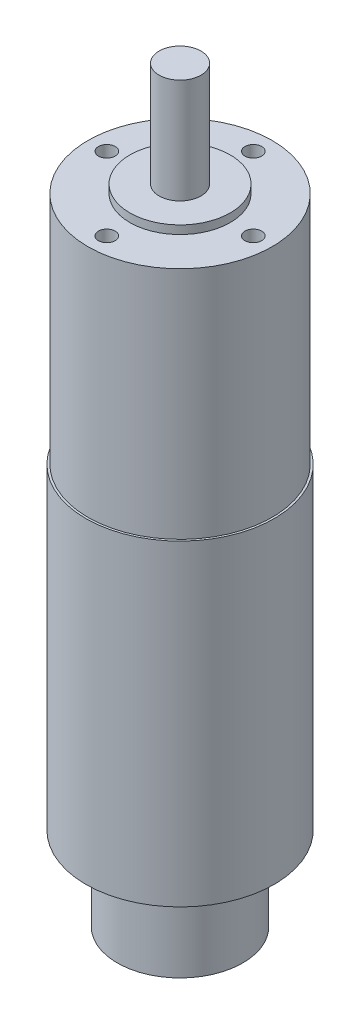
ISO-10303-21;
HEADER;
FILE_DESCRIPTION(('STEP AP214'),'2;1');
FILE_NAME('part.step','',(''),(''),'','','');
FILE_SCHEMA(('AUTOMOTIVE_DESIGN { 1 0 10303 214 1 1 1 1 }'));
ENDSEC;
DATA;
#1=APPLICATION_CONTEXT('core data for automotive mechanical design processes');
#2=APPLICATION_PROTOCOL_DEFINITION('international standard','automotive_design',2000,#1);
#3=PRODUCT_CONTEXT('',#1,'mechanical');
#4=PRODUCT('Part','Part','',(#3));
#5=PRODUCT_RELATED_PRODUCT_CATEGORY('part','',(#4));
#6=PRODUCT_DEFINITION_FORMATION('','',#4);
#7=PRODUCT_DEFINITION_CONTEXT('part definition',#1,'design');
#8=PRODUCT_DEFINITION('design','',#6,#7);
#9=PRODUCT_DEFINITION_SHAPE('','',#8);
#10=(LENGTH_UNIT() NAMED_UNIT(*) SI_UNIT(.MILLI.,.METRE.));
#11=(NAMED_UNIT(*) PLANE_ANGLE_UNIT() SI_UNIT($,.RADIAN.));
#12=(NAMED_UNIT(*) SI_UNIT($,.STERADIAN.) SOLID_ANGLE_UNIT());
#13=UNCERTAINTY_MEASURE_WITH_UNIT(LENGTH_MEASURE(1.E-05),#10,'distance_accuracy_value','');
#14=(GEOMETRIC_REPRESENTATION_CONTEXT(3) GLOBAL_UNCERTAINTY_ASSIGNED_CONTEXT((#13)) GLOBAL_UNIT_ASSIGNED_CONTEXT((#10,
#11,#12)) REPRESENTATION_CONTEXT('',''));
#15=CARTESIAN_POINT('',(0.,0.,0.));
#16=DIRECTION('',(0.,0.,1.));
#17=DIRECTION('',(1.,0.,0.));
#18=AXIS2_PLACEMENT_3D('',#15,#16,#17);
#19=CARTESIAN_POINT('',(0.,75.7,0.));
#20=DIRECTION('',(0.,-1.,0.));
#21=DIRECTION('',(0.,0.,-1.));
#22=AXIS2_PLACEMENT_3D('',#19,#20,#21);
#23=CYLINDRICAL_SURFACE('',#22,22.5);
#24=CARTESIAN_POINT('',(0.,75.7,0.));
#25=DIRECTION('',(0.,1.,0.));
#26=DIRECTION('',(0.,0.,1.));
#27=AXIS2_PLACEMENT_3D('',#24,#25,#26);
#28=CIRCLE('',#27,22.5);
#29=CARTESIAN_POINT('',(0.,75.7,22.5));
#30=VERTEX_POINT('',#29);
#31=EDGE_CURVE('E48',#30,#30,#28,.T.);
#32=ORIENTED_EDGE('',*,*,#31,.F.);
#33=EDGE_LOOP('',(#32));
#34=FACE_BOUND('',#33,.T.);
#35=CARTESIAN_POINT('',(0.,0.,0.));
#36=DIRECTION('',(0.,1.,0.));
#37=DIRECTION('',(0.,0.,1.));
#38=AXIS2_PLACEMENT_3D('',#35,#36,#37);
#39=CIRCLE('',#38,22.5);
#40=CARTESIAN_POINT('',(0.,0.,22.5));
#41=VERTEX_POINT('',#40);
#42=EDGE_CURVE('E88',#41,#41,#39,.T.);
#43=ORIENTED_EDGE('',*,*,#42,.T.);
#44=EDGE_LOOP('',(#43));
#45=FACE_BOUND('',#44,.T.);
#46=ADVANCED_FACE('F36',(#34,#45),#23,.T.);
#47=CARTESIAN_POINT('',(0.,75.7,0.));
#48=DIRECTION('',(0.,1.,0.));
#49=DIRECTION('',(0.,0.,1.));
#50=AXIS2_PLACEMENT_3D('',#47,#48,#49);
#51=PLANE('',#50);
#52=CARTESIAN_POINT('',(0.,75.7,0.));
#53=DIRECTION('',(0.,1.,0.));
#54=DIRECTION('',(0.,0.,1.));
#55=AXIS2_PLACEMENT_3D('',#52,#53,#54);
#56=CIRCLE('',#55,22.);
#57=CARTESIAN_POINT('',(0.,75.7,22.));
#58=VERTEX_POINT('',#57);
#59=EDGE_CURVE('E43',#58,#58,#56,.T.);
#60=ORIENTED_EDGE('',*,*,#59,.F.);
#61=EDGE_LOOP('',(#60));
#62=FACE_BOUND('',#61,.T.);
#63=ORIENTED_EDGE('',*,*,#31,.T.);
#64=EDGE_LOOP('',(#63));
#65=FACE_BOUND('',#64,.T.);
#66=ADVANCED_FACE('F98',(#62,#65),#51,.T.);
#67=CARTESIAN_POINT('',(0.,0.,0.));
#68=DIRECTION('',(0.,1.,0.));
#69=DIRECTION('',(0.,0.,1.));
#70=AXIS2_PLACEMENT_3D('',#67,#68,#69);
#71=PLANE('',#70);
#72=CARTESIAN_POINT('',(0.,0.,0.));
#73=DIRECTION('',(0.,-1.,0.));
#74=DIRECTION('',(0.,0.,-1.));
#75=AXIS2_PLACEMENT_3D('',#72,#73,#74);
#76=CIRCLE('',#75,15.);
#77=CARTESIAN_POINT('',(0.,0.,-15.));
#78=VERTEX_POINT('',#77);
#79=EDGE_CURVE('E10',#78,#78,#76,.T.);
#80=ORIENTED_EDGE('',*,*,#79,.F.);
#81=EDGE_LOOP('',(#80));
#82=FACE_BOUND('',#81,.T.);
#83=ORIENTED_EDGE('',*,*,#42,.F.);
#84=EDGE_LOOP('',(#83));
#85=FACE_BOUND('',#84,.T.);
#86=ADVANCED_FACE('F95',(#82,#85),#71,.F.);
#87=CARTESIAN_POINT('',(0.,131.7,0.));
#88=DIRECTION('',(0.,-1.,0.));
#89=DIRECTION('',(0.,0.,-1.));
#90=AXIS2_PLACEMENT_3D('',#87,#88,#89);
#91=CYLINDRICAL_SURFACE('',#90,22.);
#92=CARTESIAN_POINT('',(0.,131.7,0.));
#93=DIRECTION('',(0.,1.,0.));
#94=DIRECTION('',(0.,0.,1.));
#95=AXIS2_PLACEMENT_3D('',#92,#93,#94);
#96=CIRCLE('',#95,22.);
#97=CARTESIAN_POINT('',(0.,131.7,22.));
#98=VERTEX_POINT('',#97);
#99=EDGE_CURVE('E86',#98,#98,#96,.T.);
#100=ORIENTED_EDGE('',*,*,#99,.F.);
#101=EDGE_LOOP('',(#100));
#102=FACE_BOUND('',#101,.T.);
#103=ORIENTED_EDGE('',*,*,#59,.T.);
#104=EDGE_LOOP('',(#103));
#105=FACE_BOUND('',#104,.T.);
#106=ADVANCED_FACE('F97',(#102,#105),#91,.T.);
#107=CARTESIAN_POINT('',(0.,131.7,0.));
#108=DIRECTION('',(0.,1.,0.));
#109=DIRECTION('',(0.,0.,1.));
#110=AXIS2_PLACEMENT_3D('',#107,#108,#109);
#111=PLANE('',#110);
#112=CARTESIAN_POINT('',(0.,131.7,0.));
#113=DIRECTION('',(0.,1.,0.));
#114=DIRECTION('',(0.,0.,1.));
#115=AXIS2_PLACEMENT_3D('',#112,#113,#114);
#116=CIRCLE('',#115,12.);
#117=CARTESIAN_POINT('',(0.,131.7,12.));
#118=VERTEX_POINT('',#117);
#119=EDGE_CURVE('E56',#118,#118,#116,.T.);
#120=ORIENTED_EDGE('',*,*,#119,.F.);
#121=EDGE_LOOP('',(#120));
#122=FACE_BOUND('',#121,.T.);
#123=CARTESIAN_POINT('',(17.5,131.7,0.));
#124=DIRECTION('',(0.,1.,0.));
#125=DIRECTION('',(-1.,0.,0.));
#126=AXIS2_PLACEMENT_3D('',#123,#124,#125);
#127=CIRCLE('',#126,2.);
#128=CARTESIAN_POINT('',(15.5,131.7,0.));
#129=VERTEX_POINT('',#128);
#130=EDGE_CURVE('E63',#129,#129,#127,.T.);
#131=ORIENTED_EDGE('',*,*,#130,.F.);
#132=EDGE_LOOP('',(#131));
#133=FACE_BOUND('',#132,.T.);
#134=CARTESIAN_POINT('',(0.,131.7,17.5));
#135=DIRECTION('',(0.,1.,0.));
#136=DIRECTION('',(0.,0.,-1.));
#137=AXIS2_PLACEMENT_3D('',#134,#135,#136);
#138=CIRCLE('',#137,2.);
#139=CARTESIAN_POINT('',(0.,131.7,15.5));
#140=VERTEX_POINT('',#139);
#141=EDGE_CURVE('E69',#140,#140,#138,.T.);
#142=ORIENTED_EDGE('',*,*,#141,.F.);
#143=EDGE_LOOP('',(#142));
#144=FACE_BOUND('',#143,.T.);
#145=CARTESIAN_POINT('',(-17.5,131.7,-1.83302770289265E-13));
#146=DIRECTION('',(0.,1.,0.));
#147=DIRECTION('',(1.,0.,0.));
#148=AXIS2_PLACEMENT_3D('',#145,#146,#147);
#149=CIRCLE('',#148,2.);
#150=CARTESIAN_POINT('',(-15.5,131.7,-1.62353882256206E-13));
#151=VERTEX_POINT('',#150);
#152=EDGE_CURVE('E75',#151,#151,#149,.T.);
#153=ORIENTED_EDGE('',*,*,#152,.F.);
#154=EDGE_LOOP('',(#153));
#155=FACE_BOUND('',#154,.T.);
#156=CARTESIAN_POINT('',(0.,131.7,-17.5));
#157=DIRECTION('',(0.,1.,0.));
#158=DIRECTION('',(0.,0.,1.));
#159=AXIS2_PLACEMENT_3D('',#156,#157,#158);
#160=CIRCLE('',#159,2.);
#161=CARTESIAN_POINT('',(0.,131.7,-15.5));
#162=VERTEX_POINT('',#161);
#163=EDGE_CURVE('E62',#162,#162,#160,.T.);
#164=ORIENTED_EDGE('',*,*,#163,.F.);
#165=EDGE_LOOP('',(#164));
#166=FACE_BOUND('',#165,.T.);
#167=ORIENTED_EDGE('',*,*,#99,.T.);
#168=EDGE_LOOP('',(#167));
#169=FACE_BOUND('',#168,.T.);
#170=ADVANCED_FACE('F105',(#122,#133,#144,#155,#166,#169),#111,.T.);
#171=CARTESIAN_POINT('',(0.,122.7,-17.5));
#172=DIRECTION('',(0.,1.,0.));
#173=DIRECTION('',(0.,0.,1.));
#174=AXIS2_PLACEMENT_3D('',#171,#172,#173);
#175=CYLINDRICAL_SURFACE('',#174,2.);
#176=CARTESIAN_POINT('',(0.,122.7,-17.5));
#177=DIRECTION('',(0.,1.,0.));
#178=DIRECTION('',(0.,0.,1.));
#179=AXIS2_PLACEMENT_3D('',#176,#177,#178);
#180=CIRCLE('',#179,2.);
#181=CARTESIAN_POINT('',(0.,122.7,-15.5));
#182=VERTEX_POINT('',#181);
#183=EDGE_CURVE('E78',#182,#182,#180,.T.);
#184=ORIENTED_EDGE('',*,*,#183,.F.);
#185=EDGE_LOOP('',(#184));
#186=FACE_BOUND('',#185,.T.);
#187=ORIENTED_EDGE('',*,*,#163,.T.);
#188=EDGE_LOOP('',(#187));
#189=FACE_BOUND('',#188,.T.);
#190=ADVANCED_FACE('F136',(#186,#189),#175,.F.);
#191=CARTESIAN_POINT('',(0.,122.7,-17.5));
#192=DIRECTION('',(0.,1.,0.));
#193=DIRECTION('',(0.,0.,1.));
#194=AXIS2_PLACEMENT_3D('',#191,#192,#193);
#195=PLANE('',#194);
#196=ORIENTED_EDGE('',*,*,#183,.T.);
#197=EDGE_LOOP('',(#196));
#198=FACE_BOUND('',#197,.T.);
#199=ADVANCED_FACE('F146',(#198),#195,.T.);
#200=CARTESIAN_POINT('',(-17.5,122.7,-1.83302770289265E-13));
#201=DIRECTION('',(0.,1.,0.));
#202=DIRECTION('',(0.,0.,1.));
#203=AXIS2_PLACEMENT_3D('',#200,#201,#202);
#204=CYLINDRICAL_SURFACE('',#203,2.);
#205=CARTESIAN_POINT('',(-17.5,122.7,-1.83302770289265E-13));
#206=DIRECTION('',(0.,1.,0.));
#207=DIRECTION('',(1.,0.,0.));
#208=AXIS2_PLACEMENT_3D('',#205,#206,#207);
#209=CIRCLE('',#208,2.);
#210=CARTESIAN_POINT('',(-15.5,122.7,-1.62353882256206E-13));
#211=VERTEX_POINT('',#210);
#212=EDGE_CURVE('E72',#211,#211,#209,.T.);
#213=ORIENTED_EDGE('',*,*,#212,.F.);
#214=EDGE_LOOP('',(#213));
#215=FACE_BOUND('',#214,.T.);
#216=ORIENTED_EDGE('',*,*,#152,.T.);
#217=EDGE_LOOP('',(#216));
#218=FACE_BOUND('',#217,.T.);
#219=ADVANCED_FACE('F154',(#215,#218),#204,.F.);
#220=CARTESIAN_POINT('',(-17.5,122.7,-1.83302770289265E-13));
#221=DIRECTION('',(0.,1.,0.));
#222=DIRECTION('',(1.,0.,0.));
#223=AXIS2_PLACEMENT_3D('',#220,#221,#222);
#224=PLANE('',#223);
#225=ORIENTED_EDGE('',*,*,#212,.T.);
#226=EDGE_LOOP('',(#225));
#227=FACE_BOUND('',#226,.T.);
#228=ADVANCED_FACE('F162',(#227),#224,.T.);
#229=CARTESIAN_POINT('',(0.,122.7,17.5));
#230=DIRECTION('',(0.,1.,0.));
#231=DIRECTION('',(0.,0.,1.));
#232=AXIS2_PLACEMENT_3D('',#229,#230,#231);
#233=CYLINDRICAL_SURFACE('',#232,2.);
#234=CARTESIAN_POINT('',(0.,122.7,17.5));
#235=DIRECTION('',(0.,1.,0.));
#236=DIRECTION('',(0.,0.,-1.));
#237=AXIS2_PLACEMENT_3D('',#234,#235,#236);
#238=CIRCLE('',#237,2.);
#239=CARTESIAN_POINT('',(0.,122.7,15.5));
#240=VERTEX_POINT('',#239);
#241=EDGE_CURVE('E66',#240,#240,#238,.T.);
#242=ORIENTED_EDGE('',*,*,#241,.F.);
#243=EDGE_LOOP('',(#242));
#244=FACE_BOUND('',#243,.T.);
#245=ORIENTED_EDGE('',*,*,#141,.T.);
#246=EDGE_LOOP('',(#245));
#247=FACE_BOUND('',#246,.T.);
#248=ADVANCED_FACE('F170',(#244,#247),#233,.F.);
#249=CARTESIAN_POINT('',(0.,122.7,17.5));
#250=DIRECTION('',(0.,1.,0.));
#251=DIRECTION('',(0.,0.,-1.));
#252=AXIS2_PLACEMENT_3D('',#249,#250,#251);
#253=PLANE('',#252);
#254=ORIENTED_EDGE('',*,*,#241,.T.);
#255=EDGE_LOOP('',(#254));
#256=FACE_BOUND('',#255,.T.);
#257=ADVANCED_FACE('F178',(#256),#253,.T.);
#258=CARTESIAN_POINT('',(17.5,122.7,0.));
#259=DIRECTION('',(0.,1.,0.));
#260=DIRECTION('',(0.,0.,1.));
#261=AXIS2_PLACEMENT_3D('',#258,#259,#260);
#262=CYLINDRICAL_SURFACE('',#261,2.);
#263=CARTESIAN_POINT('',(17.5,122.7,0.));
#264=DIRECTION('',(0.,1.,0.));
#265=DIRECTION('',(-1.,0.,0.));
#266=AXIS2_PLACEMENT_3D('',#263,#264,#265);
#267=CIRCLE('',#266,2.);
#268=CARTESIAN_POINT('',(15.5,122.7,0.));
#269=VERTEX_POINT('',#268);
#270=EDGE_CURVE('E59',#269,#269,#267,.T.);
#271=ORIENTED_EDGE('',*,*,#270,.F.);
#272=EDGE_LOOP('',(#271));
#273=FACE_BOUND('',#272,.T.);
#274=ORIENTED_EDGE('',*,*,#130,.T.);
#275=EDGE_LOOP('',(#274));
#276=FACE_BOUND('',#275,.T.);
#277=ADVANCED_FACE('F186',(#273,#276),#262,.F.);
#278=CARTESIAN_POINT('',(17.5,122.7,0.));
#279=DIRECTION('',(0.,1.,0.));
#280=DIRECTION('',(-1.,0.,0.));
#281=AXIS2_PLACEMENT_3D('',#278,#279,#280);
#282=PLANE('',#281);
#283=ORIENTED_EDGE('',*,*,#270,.T.);
#284=EDGE_LOOP('',(#283));
#285=FACE_BOUND('',#284,.T.);
#286=ADVANCED_FACE('F194',(#285),#282,.T.);
#287=CARTESIAN_POINT('',(0.,133.7,0.));
#288=DIRECTION('',(0.,-1.,0.));
#289=DIRECTION('',(0.,0.,-1.));
#290=AXIS2_PLACEMENT_3D('',#287,#288,#289);
#291=CYLINDRICAL_SURFACE('',#290,12.);
#292=CARTESIAN_POINT('',(0.,133.7,0.));
#293=DIRECTION('',(0.,1.,0.));
#294=DIRECTION('',(0.,0.,1.));
#295=AXIS2_PLACEMENT_3D('',#292,#293,#294);
#296=CIRCLE('',#295,12.);
#297=CARTESIAN_POINT('',(0.,133.7,12.));
#298=VERTEX_POINT('',#297);
#299=EDGE_CURVE('E53',#298,#298,#296,.T.);
#300=ORIENTED_EDGE('',*,*,#299,.F.);
#301=EDGE_LOOP('',(#300));
#302=FACE_BOUND('',#301,.T.);
#303=ORIENTED_EDGE('',*,*,#119,.T.);
#304=EDGE_LOOP('',(#303));
#305=FACE_BOUND('',#304,.T.);
#306=ADVANCED_FACE('F201',(#302,#305),#291,.T.);
#307=CARTESIAN_POINT('',(0.,133.7,0.));
#308=DIRECTION('',(0.,1.,0.));
#309=DIRECTION('',(0.,0.,1.));
#310=AXIS2_PLACEMENT_3D('',#307,#308,#309);
#311=PLANE('',#310);
#312=CARTESIAN_POINT('',(0.,133.7,0.));
#313=DIRECTION('',(0.,1.,0.));
#314=DIRECTION('',(0.,0.,1.));
#315=AXIS2_PLACEMENT_3D('',#312,#313,#314);
#316=CIRCLE('',#315,5.);
#317=CARTESIAN_POINT('',(0.,133.7,5.));
#318=VERTEX_POINT('',#317);
#319=EDGE_CURVE('E39',#318,#318,#316,.T.);
#320=ORIENTED_EDGE('',*,*,#319,.F.);
#321=EDGE_LOOP('',(#320));
#322=FACE_BOUND('',#321,.T.);
#323=ORIENTED_EDGE('',*,*,#299,.T.);
#324=EDGE_LOOP('',(#323));
#325=FACE_BOUND('',#324,.T.);
#326=ADVANCED_FACE('F208',(#322,#325),#311,.T.);
#327=CARTESIAN_POINT('',(0.,158.7,0.));
#328=DIRECTION('',(0.,1.,0.));
#329=DIRECTION('',(0.,0.,1.));
#330=AXIS2_PLACEMENT_3D('',#327,#328,#329);
#331=PLANE('',#330);
#332=CARTESIAN_POINT('',(0.,158.7,0.));
#333=DIRECTION('',(0.,1.,0.));
#334=DIRECTION('',(0.,0.,1.));
#335=AXIS2_PLACEMENT_3D('',#332,#333,#334);
#336=CIRCLE('',#335,5.);
#337=CARTESIAN_POINT('',(0.,158.7,5.));
#338=VERTEX_POINT('',#337);
#339=EDGE_CURVE('E81',#338,#338,#336,.T.);
#340=ORIENTED_EDGE('',*,*,#339,.T.);
#341=EDGE_LOOP('',(#340));
#342=FACE_BOUND('',#341,.T.);
#343=ADVANCED_FACE('F216',(#342),#331,.T.);
#344=CARTESIAN_POINT('',(0.,158.7,0.));
#345=DIRECTION('',(0.,-1.,0.));
#346=DIRECTION('',(0.,0.,-1.));
#347=AXIS2_PLACEMENT_3D('',#344,#345,#346);
#348=CYLINDRICAL_SURFACE('',#347,5.);
#349=ORIENTED_EDGE('',*,*,#319,.T.);
#350=EDGE_LOOP('',(#349));
#351=FACE_BOUND('',#350,.T.);
#352=ORIENTED_EDGE('',*,*,#339,.F.);
#353=EDGE_LOOP('',(#352));
#354=FACE_BOUND('',#353,.T.);
#355=ADVANCED_FACE('F223',(#351,#354),#348,.T.);
#356=CARTESIAN_POINT('',(0.,-20.,0.));
#357=DIRECTION('',(0.,1.,0.));
#358=DIRECTION('',(0.,0.,1.));
#359=AXIS2_PLACEMENT_3D('',#356,#357,#358);
#360=CYLINDRICAL_SURFACE('',#359,15.);
#361=CARTESIAN_POINT('',(0.,-20.,0.));
#362=DIRECTION('',(0.,-1.,0.));
#363=DIRECTION('',(0.,0.,-1.));
#364=AXIS2_PLACEMENT_3D('',#361,#362,#363);
#365=CIRCLE('',#364,15.);
#366=CARTESIAN_POINT('',(0.,-20.,-15.));
#367=VERTEX_POINT('',#366);
#368=EDGE_CURVE('E52',#367,#367,#365,.T.);
#369=ORIENTED_EDGE('',*,*,#368,.F.);
#370=EDGE_LOOP('',(#369));
#371=FACE_BOUND('',#370,.T.);
#372=ORIENTED_EDGE('',*,*,#79,.T.);
#373=EDGE_LOOP('',(#372));
#374=FACE_BOUND('',#373,.T.);
#375=ADVANCED_FACE('F230',(#371,#374),#360,.T.);
#376=CARTESIAN_POINT('',(0.,-20.,0.));
#377=DIRECTION('',(0.,-1.,0.));
#378=DIRECTION('',(0.,0.,-1.));
#379=AXIS2_PLACEMENT_3D('',#376,#377,#378);
#380=PLANE('',#379);
#381=ORIENTED_EDGE('',*,*,#368,.T.);
#382=EDGE_LOOP('',(#381));
#383=FACE_BOUND('',#382,.T.);
#384=ADVANCED_FACE('F237',(#383),#380,.T.);
#385=CLOSED_SHELL('',(#46,#66,#86,#106,#170,#190,#199,#219,#228,#248,#257,#277,#286,#306,#326,
#343,#355,#375,#384));
#386=MANIFOLD_SOLID_BREP('B2',#385);
#387=ADVANCED_BREP_SHAPE_REPRESENTATION('',(#18,#386),#14);
#388=SHAPE_DEFINITION_REPRESENTATION(#9,#387);
ENDSEC;
END-ISO-10303-21;
